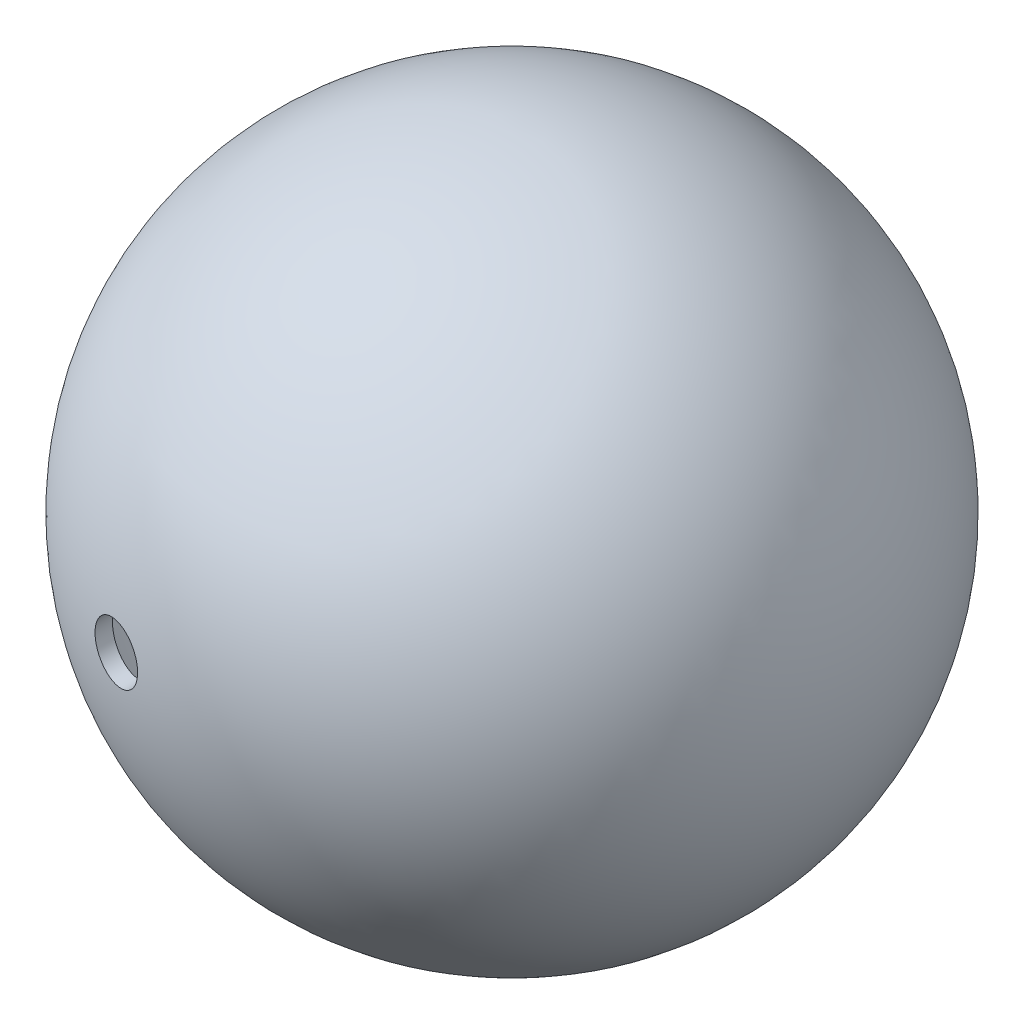
ISO-10303-21;
HEADER;
FILE_DESCRIPTION(('STEP AP214'),'2;1');
FILE_NAME('part.step','',(''),(''),'','','');
FILE_SCHEMA(('AUTOMOTIVE_DESIGN { 1 0 10303 214 1 1 1 1 }'));
ENDSEC;
DATA;
#1=APPLICATION_CONTEXT('core data for automotive mechanical design processes');
#2=APPLICATION_PROTOCOL_DEFINITION('international standard','automotive_design',2000,#1);
#3=PRODUCT_CONTEXT('',#1,'mechanical');
#4=PRODUCT('Part','Part','',(#3));
#5=PRODUCT_RELATED_PRODUCT_CATEGORY('part','',(#4));
#6=PRODUCT_DEFINITION_FORMATION('','',#4);
#7=PRODUCT_DEFINITION_CONTEXT('part definition',#1,'design');
#8=PRODUCT_DEFINITION('design','',#6,#7);
#9=PRODUCT_DEFINITION_SHAPE('','',#8);
#10=(LENGTH_UNIT() NAMED_UNIT(*) SI_UNIT(.MILLI.,.METRE.));
#11=(NAMED_UNIT(*) PLANE_ANGLE_UNIT() SI_UNIT($,.RADIAN.));
#12=(NAMED_UNIT(*) SI_UNIT($,.STERADIAN.) SOLID_ANGLE_UNIT());
#13=UNCERTAINTY_MEASURE_WITH_UNIT(LENGTH_MEASURE(1.E-05),#10,'distance_accuracy_value','');
#14=(GEOMETRIC_REPRESENTATION_CONTEXT(3) GLOBAL_UNCERTAINTY_ASSIGNED_CONTEXT((#13)) GLOBAL_UNIT_ASSIGNED_CONTEXT((#10,
#11,#12)) REPRESENTATION_CONTEXT('',''));
#15=CARTESIAN_POINT('',(0.,0.,0.));
#16=DIRECTION('',(0.,0.,1.));
#17=DIRECTION('',(1.,0.,0.));
#18=AXIS2_PLACEMENT_3D('',#15,#16,#17);
#19=CARTESIAN_POINT('',(0.,0.,0.));
#20=DIRECTION('',(0.,1.,0.));
#21=DIRECTION('',(1.,0.,0.));
#22=AXIS2_PLACEMENT_3D('',#19,#20,#21);
#23=SPHERICAL_SURFACE('',#22,12.98);
#24=CARTESIAN_POINT('',(-3.89947289119737,-0.633204957340862,12.3642048936766));
#25=CARTESIAN_POINT('',(-3.86347402960538,-0.684336265587655,12.3729395038252));
#26=CARTESIAN_POINT('',(-3.82315602540882,-0.732316081182053,12.3827128415907));
#27=CARTESIAN_POINT('',(-3.73517450469108,-0.820618555667838,12.4040100900181));
#28=CARTESIAN_POINT('',(-3.68749971764789,-0.860929250324411,12.4155366862613));
#29=CARTESIAN_POINT('',(-3.58635865770695,-0.93274988924588,12.4399516311496));
#30=CARTESIAN_POINT('',(-3.53290194195186,-0.964274057569683,12.4528377317831));
#31=CARTESIAN_POINT('',(-3.42168752687481,-1.01783566328814,12.4796015065705));
#32=CARTESIAN_POINT('',(-3.36393095319897,-1.03987557336427,12.4934789211732));
#33=CARTESIAN_POINT('',(-3.24453851880642,-1.07430660843086,12.522115543174));
#34=CARTESIAN_POINT('',(-3.1828491778697,-1.08650251265162,12.5368866259211));
#35=CARTESIAN_POINT('',(-3.0583406970183,-1.10023648515423,12.5666454265199));
#36=CARTESIAN_POINT('',(-2.99552139128842,-1.10177297622939,12.5816331761017));
#37=CARTESIAN_POINT('',(-2.86961017544639,-1.09408932709861,12.6116203105305));
#38=CARTESIAN_POINT('',(-2.8065267217662,-1.08471858161784,12.6266169315695));
#39=CARTESIAN_POINT('',(-2.68278191440778,-1.0551866337861,12.655983733104));
#40=CARTESIAN_POINT('',(-2.62212058071725,-1.03502534240968,12.67035390843));
#41=CARTESIAN_POINT('',(-2.50521624637742,-0.984494165872218,12.6980035093477));
#42=CARTESIAN_POINT('',(-2.44895769149386,-0.9541624247022,12.7112867831258));
#43=CARTESIAN_POINT('',(-2.34231961507966,-0.884040352638639,12.7364296630988));
#44=CARTESIAN_POINT('',(-2.291939532107,-0.844250926135402,12.7482894052558));
#45=CARTESIAN_POINT('',(-2.1995754853051,-0.757146781453644,12.7700063808177));
#46=CARTESIAN_POINT('',(-2.15744652779762,-0.709994538671565,12.7798982555748));
#47=CARTESIAN_POINT('',(-2.08174291335744,-0.608924024543547,12.7976568800191));
#48=CARTESIAN_POINT('',(-2.04816694546041,-0.555006791998425,12.805523940063));
#49=CARTESIAN_POINT('',(-1.99146543210071,-0.443472834045484,12.8188006654771));
#50=CARTESIAN_POINT('',(-1.96808667401949,-0.385991899056834,12.8242698930764));
#51=CARTESIAN_POINT('',(-1.93129238192234,-0.267760079747284,12.8328743622384));
#52=CARTESIAN_POINT('',(-1.91787545459748,-0.207009653988097,12.8360099301979));
#53=CARTESIAN_POINT('',(-1.90163937122023,-0.0853705007425076,12.8398040216704));
#54=CARTESIAN_POINT('',(-1.89859814457086,-0.0245129441589638,12.8405144505054));
#55=CARTESIAN_POINT('',(-1.90259141759655,0.0968500615558506,12.8395814461705));
#56=CARTESIAN_POINT('',(-1.90962526930268,0.157355533079852,12.8379381643771));
#57=CARTESIAN_POINT('',(-1.93344398306831,0.275830278778367,12.8323709294729));
#58=CARTESIAN_POINT('',(-1.95015556342003,0.333815130227916,12.8284641161726));
#59=CARTESIAN_POINT('',(-1.99273429844873,0.446119405242145,12.8185029884239));
#60=CARTESIAN_POINT('',(-2.01860169147492,0.500438733340044,12.8124486180691));
#61=CARTESIAN_POINT('',(-2.07896686209375,0.604439043780939,12.798306492972));
#62=CARTESIAN_POINT('',(-2.1135426370796,0.6540722107765,12.7902003579762));
#63=CARTESIAN_POINT('',(-2.19014950721767,0.746834516630825,12.7722192120379));
#64=CARTESIAN_POINT('',(-2.23218133245367,0.789963017797907,12.7623440278721));
#65=CARTESIAN_POINT('',(-2.32347875816805,0.869520019063363,12.7408651614933));
#66=CARTESIAN_POINT('',(-2.37288326464253,0.905780075092502,12.7292282063553));
#67=CARTESIAN_POINT('',(-2.47678612116844,0.969517095603996,12.7047169727589));
#68=CARTESIAN_POINT('',(-2.53128514307572,0.996992899516551,12.6918425310965));
#69=CARTESIAN_POINT('',(-2.64534071413173,1.04311922192829,12.6648546083289));
#70=CARTESIAN_POINT('',(-2.70499175458851,1.06152245982691,12.6507176570829));
#71=CARTESIAN_POINT('',(-2.82641644332501,1.08799416567113,12.621890075965));
#72=CARTESIAN_POINT('',(-2.88819034414862,1.09606139960393,12.6071993801971));
#73=CARTESIAN_POINT('',(-3.01337667711194,1.10173576012323,12.5773751808483));
#74=CARTESIAN_POINT('',(-3.0767977384234,1.09913822845364,12.5622386006044));
#75=CARTESIAN_POINT('',(-3.20231737152421,1.08308420645977,12.5322272969657));
#76=CARTESIAN_POINT('',(-3.26441587344272,1.06962714387956,12.5173525874129));
#77=CARTESIAN_POINT('',(-3.38577035196042,1.03210022530322,12.4882340943519));
#78=CARTESIAN_POINT('',(-3.4450138567443,1.00798779347408,12.4739930968292));
#79=CARTESIAN_POINT('',(-3.55863735431063,0.949736458463024,12.4466366197832));
#80=CARTESIAN_POINT('',(-3.61301758480918,0.915598045699332,12.4335210852487));
#81=CARTESIAN_POINT('',(-3.71452390709142,0.838720734114874,12.4090049964268));
#82=CARTESIAN_POINT('',(-3.76174042584868,0.79610814634968,12.3975831141567));
#83=CARTESIAN_POINT('',(-3.84831237736135,0.703134986490585,12.3766164968889));
#84=CARTESIAN_POINT('',(-3.88766894630155,0.652775536100112,12.3670714905848));
#85=CARTESIAN_POINT('',(-3.95629095567472,0.547147231418268,12.3504138428761));
#86=CARTESIAN_POINT('',(-3.9857940041799,0.492041794601926,12.3432439686869));
#87=CARTESIAN_POINT('',(-4.03510693024533,0.377417470714795,12.3312527597219));
#88=CARTESIAN_POINT('',(-4.0549188304659,0.317899507580594,12.3264309348806));
#89=CARTESIAN_POINT('',(-4.08377698031408,0.197835804615348,12.3194054330408));
#90=CARTESIAN_POINT('',(-4.0930943245287,0.137358975916602,12.3171358298861));
#91=CARTESIAN_POINT('',(-4.10157904938693,0.0156403098949137,12.3150690960885));
#92=CARTESIAN_POINT('',(-4.10074478919225,-0.0456016495005932,12.3152723651442));
#93=CARTESIAN_POINT('',(-4.08903436336953,-0.16621870889189,12.3181246838287));
#94=CARTESIAN_POINT('',(-4.07829296621082,-0.225607829476065,12.3207409095826));
#95=CARTESIAN_POINT('',(-4.04731837823105,-0.341645577950844,12.3282806512792));
#96=CARTESIAN_POINT('',(-4.02709714844567,-0.398297560308858,12.3332012596937));
#97=CARTESIAN_POINT('',(-3.98817587897262,-0.484479860929397,12.3426640802939));
#98=CARTESIAN_POINT('',(-3.97238231787804,-0.515436456751616,12.3465024794598));
#99=CARTESIAN_POINT('',(-3.93799094065438,-0.575651996621588,12.3548562059085));
#100=CARTESIAN_POINT('',(-3.91939319034965,-0.604910980496049,12.3593715173018));
#101=CARTESIAN_POINT('',(-3.89947289119737,-0.633204957340862,12.3642048936766));
#102=B_SPLINE_CURVE_WITH_KNOTS('',3,(#24,#25,#26,#27,#28,#29,#30,#31,#32,#33,#34,#35,#36,#37,
#38,#39,#40,#41,#42,#43,#44,#45,#46,#47,#48,#49,#50,#51,#52,#53,#54,#55,#56,#57,#58,#59,#60,#61,
#62,#63,#64,#65,#66,#67,#68,#69,#70,#71,#72,#73,#74,#75,#76,#77,#78,#79,#80,#81,#82,#83,#84,#85,
#86,#87,#88,#89,#90,#91,#92,#93,#94,#95,#96,#97,#98,#99,#100,#101),.UNSPECIFIED.,.T.,.F.,(4,2,2,
2,2,2,2,2,2,2,2,2,2,2,2,2,2,2,2,2,2,2,2,2,2,2,2,2,2,2,2,2,2,2,2,2,2,2,4),(0.,0.189287328669088,
0.378867576686953,0.56813911642103,0.7573612804231,0.950249659580072,1.14316657861541,
1.33877917710285,1.53439338948175,1.7292820127676,1.92415200733851,2.11520911082475,
2.30623691228077,2.49220566802539,2.67814840839458,2.86008557697745,3.04201104497268,
3.22257662222587,3.40314690040852,3.58539586370391,3.76766268236839,3.95394297146272,
4.14024786162947,4.33138304113057,4.52254103808498,4.71738435973995,4.91223794956646,
5.10787725996042,5.30350700230231,5.49641404129513,5.68929317464696,5.87711319409825,
6.06489399648732,6.24770406247737,6.4305436770718,6.61093220281542,6.79109373611338,
6.89584006822657,7.00058394195125),.UNSPECIFIED.);
#103=CARTESIAN_POINT('',(-3.89947289119737,-0.633204957340862,12.3642048936766));
#104=VERTEX_POINT('',#103);
#105=EDGE_CURVE('E10',#104,#104,#102,.T.);
#106=ORIENTED_EDGE('',*,*,#105,.F.);
#107=EDGE_LOOP('',(#106));
#108=FACE_BOUND('',#107,.T.);
#109=CARTESIAN_POINT('',(0.,0.,-12.4774087591241));
#110=DIRECTION('',(0.,0.,-1.));
#111=DIRECTION('',(-1.,0.,0.));
#112=AXIS2_PLACEMENT_3D('',#109,#110,#111);
#113=CIRCLE('',#112,3.57696388823448);
#114=CARTESIAN_POINT('',(-3.57696388823448,0.,-12.4774087591241));
#115=VERTEX_POINT('',#114);
#116=EDGE_CURVE('E71',#115,#115,#113,.T.);
#117=ORIENTED_EDGE('',*,*,#116,.F.);
#118=EDGE_LOOP('',(#117));
#119=FACE_BOUND('',#118,.T.);
#120=ADVANCED_FACE('F32',(#108,#119),#23,.T.);
#121=CARTESIAN_POINT('',(0.,0.,0.));
#122=DIRECTION('',(0.,1.,0.));
#123=DIRECTION('',(1.,0.,0.));
#124=AXIS2_PLACEMENT_3D('',#121,#122,#123);
#125=SPHERICAL_SURFACE('',#124,12.33);
#126=CARTESIAN_POINT('',(-3.89423857841952,-0.640575807275164,11.6813299127061));
#127=CARTESIAN_POINT('',(-3.85775168175633,-0.691505855556212,11.6907004718159));
#128=CARTESIAN_POINT('',(-3.81696509159421,-0.739223212932149,11.7011640014424));
#129=CARTESIAN_POINT('',(-3.72811549347727,-0.826894922693143,11.7239215486656));
#130=CARTESIAN_POINT('',(-3.68004101211075,-0.866836803491528,11.7362184520507));
#131=CARTESIAN_POINT('',(-3.57819710896939,-0.937834038809236,11.7622228270749));
#132=CARTESIAN_POINT('',(-3.52443782093705,-0.968904852812223,11.7759277875105));
#133=CARTESIAN_POINT('',(-3.41271713300457,-1.02150731349265,11.8043550893527));
#134=CARTESIAN_POINT('',(-3.35475685131224,-1.04304148783234,11.8190771599794));
#135=CARTESIAN_POINT('',(-3.23492437803613,-1.07645792659961,11.8494552267948));
#136=CARTESIAN_POINT('',(-3.17299487658737,-1.08812275102135,11.8651244962458));
#137=CARTESIAN_POINT('',(-3.04809735110112,-1.1007395624117,11.8966619112228));
#138=CARTESIAN_POINT('',(-2.98512916395858,-1.1016898505239,11.9125300878875));
#139=CARTESIAN_POINT('',(-2.85894917270471,-1.09277803432639,11.9442647516258));
#140=CARTESIAN_POINT('',(-2.79574781632589,-1.08275396486635,11.96012766214));
#141=CARTESIAN_POINT('',(-2.67187161406038,-1.05185862975064,11.9911597111651));
#142=CARTESIAN_POINT('',(-2.61119678222989,-1.03098730375545,12.0063288458163));
#143=CARTESIAN_POINT('',(-2.4944472361188,-0.979019530976722,12.0354654254668));
#144=CARTESIAN_POINT('',(-2.43835175318607,-0.947972868987433,12.0494383116953));
#145=CARTESIAN_POINT('',(-2.33215852169005,-0.876405111618228,12.0758487686261));
#146=CARTESIAN_POINT('',(-2.28206011160448,-0.835885062683024,12.0882865086713));
#147=CARTESIAN_POINT('',(-2.19051068611181,-0.74745383396816,12.110985184453));
#148=CARTESIAN_POINT('',(-2.14889219024592,-0.699726991745772,12.1212883657112));
#149=CARTESIAN_POINT('',(-2.0743040534998,-0.597565732522574,12.1397348007515));
#150=CARTESIAN_POINT('',(-2.04133291737108,-0.543132477549204,12.1478784279533));
#151=CARTESIAN_POINT('',(-1.98600320550661,-0.430828854076708,12.1615346985292));
#152=CARTESIAN_POINT('',(-1.96336075390828,-0.373106866502893,12.167117744494));
#153=CARTESIAN_POINT('',(-1.92806232592623,-0.254510351422112,12.175818049115));
#154=CARTESIAN_POINT('',(-1.91540481518788,-0.19363630981407,12.1789356866231));
#155=CARTESIAN_POINT('',(-1.90069042842959,-0.0719989410932524,12.1825596919018));
#156=CARTESIAN_POINT('',(-1.89839183652547,-0.0112665175828894,12.183125602065));
#157=CARTESIAN_POINT('',(-1.90381222079359,0.109719523717276,12.1817908008469));
#158=CARTESIAN_POINT('',(-1.91153052207379,0.169973173489462,12.1798902556438));
#159=CARTESIAN_POINT('',(-1.93662729615165,0.287820915290548,12.1737071415375));
#160=CARTESIAN_POINT('',(-1.95393183956863,0.3454317515228,12.1694428021302));
#161=CARTESIAN_POINT('',(-1.99758604642471,0.456890520775181,12.1586764300414));
#162=CARTESIAN_POINT('',(-2.02393599979012,0.510738333115102,12.1521743256345));
#163=CARTESIAN_POINT('',(-2.08518808249646,0.613800988661716,12.1370436736015));
#164=CARTESIAN_POINT('',(-2.12018018738811,0.66295901673982,12.1283927482544));
#165=CARTESIAN_POINT('',(-2.19749531071848,0.754709587199057,12.1092534664174));
#166=CARTESIAN_POINT('',(-2.23981913093077,0.79730141055672,12.0987649089684));
#167=CARTESIAN_POINT('',(-2.33169350436811,0.875847118205251,12.0759625649929));
#168=CARTESIAN_POINT('',(-2.3813966112871,0.911611273715355,12.0636101261537));
#169=CARTESIAN_POINT('',(-2.48578246000546,0.974314690876098,12.0376232685963));
#170=CARTESIAN_POINT('',(-2.54046592479811,1.00125266862192,12.0239886637381));
#171=CARTESIAN_POINT('',(-2.65493706198322,1.04633777753928,11.995394432145));
#172=CARTESIAN_POINT('',(-2.714826166912,1.064210506997,11.9804080123852));
#173=CARTESIAN_POINT('',(-2.83662519023071,1.08957781020603,11.9498695396523));
#174=CARTESIAN_POINT('',(-2.89853537209928,1.09707102525228,11.9343174129001));
#175=CARTESIAN_POINT('',(-3.0240109672061,1.1015655112816,11.9027345027742));
#176=CARTESIAN_POINT('',(-3.08758373787051,1.09834201062414,11.8867005446218));
#177=CARTESIAN_POINT('',(-3.21330230247774,1.08098531466911,11.8549288754347));
#178=CARTESIAN_POINT('',(-3.27544801462931,1.06685149565048,11.8391911813895));
#179=CARTESIAN_POINT('',(-3.39678914828294,1.02792707492006,11.8084039193739));
#180=CARTESIAN_POINT('',(-3.45597158942173,1.00309350739992,11.793357399366));
#181=CARTESIAN_POINT('',(-3.56935360770841,0.94336693150768,11.764479887607));
#182=CARTESIAN_POINT('',(-3.62355347135851,0.908474502006026,11.7506488259681));
#183=CARTESIAN_POINT('',(-3.7244656393364,0.830158733273977,11.7248569343794));
#184=CARTESIAN_POINT('',(-3.77128351850179,0.786880233027356,11.7128698085625));
#185=CARTESIAN_POINT('',(-3.85694498529733,0.69260344044194,11.6909089026003));
#186=CARTESIAN_POINT('',(-3.8957898926853,0.641606428172513,11.6809347892478));
#187=CARTESIAN_POINT('',(-3.96316869169015,0.534946377306921,11.6636169741754));
#188=CARTESIAN_POINT('',(-3.9919729189442,0.479465333574898,11.6562043640814));
#189=CARTESIAN_POINT('',(-4.03983487679804,0.364191635903038,11.6438794654926));
#190=CARTESIAN_POINT('',(-4.05889484495732,0.30439997540504,11.6389666029858));
#191=CARTESIAN_POINT('',(-4.08618773235738,0.184091617850248,11.6319295782436));
#192=CARTESIAN_POINT('',(-4.09472192469567,0.123647670689082,11.6297278208508));
#193=CARTESIAN_POINT('',(-4.10167983764615,0.00212712013117659,11.6279328279403));
#194=CARTESIAN_POINT('',(-4.10010198990579,-0.0589495799372979,11.6283399970607));
#195=CARTESIAN_POINT('',(-4.08698674491201,-0.179049488812694,11.631723098003));
#196=CARTESIAN_POINT('',(-4.07559287419262,-0.238089596578929,11.6346620114797));
#197=CARTESIAN_POINT('',(-4.0434245312293,-0.353319949508063,11.6429536562815));
#198=CARTESIAN_POINT('',(-4.02266188735208,-0.409513689101712,11.6483033439182));
#199=CARTESIAN_POINT('',(-3.98311736873325,-0.494632619196736,11.6584822938749));
#200=CARTESIAN_POINT('',(-3.96722259597301,-0.525024790432751,11.6625719301515));
#201=CARTESIAN_POINT('',(-3.93272353188613,-0.584121147319811,11.6714428652333));
#202=CARTESIAN_POINT('',(-3.91411931667609,-0.612825380358452,11.6762241446081));
#203=CARTESIAN_POINT('',(-3.89423857841952,-0.640575807275164,11.6813299127061));
#204=B_SPLINE_CURVE_WITH_KNOTS('',3,(#126,#127,#128,#129,#130,#131,#132,#133,#134,#135,#136,
#137,#138,#139,#140,#141,#142,#143,#144,#145,#146,#147,#148,#149,#150,#151,#152,#153,#154,#155,
#156,#157,#158,#159,#160,#161,#162,#163,#164,#165,#166,#167,#168,#169,#170,#171,#172,#173,#174,
#175,#176,#177,#178,#179,#180,#181,#182,#183,#184,#185,#186,#187,#188,#189,#190,#191,#192,#193,
#194,#195,#196,#197,#198,#199,#200,#201,#202,#203),.UNSPECIFIED.,.T.,.F.,(4,2,2,2,2,2,2,2,2,2,2,
2,2,2,2,2,2,2,2,2,2,2,2,2,2,2,2,2,2,2,2,2,2,2,2,2,2,2,4),(0.,0.189913425448115,
0.380128999789478,0.57001103608797,0.759842714467535,0.953755231429849,1.14769849399646,
1.34454313137859,1.54138886375081,1.73728551987691,1.93316054717614,2.1246810849295,
2.31616848425834,2.5020180834332,2.68783911811498,2.86930095235598,3.05075056117062,
3.23081992316923,3.41089505734623,3.59293047056877,3.77498580319878,3.96153346287635,
4.14810824677695,4.34003620855183,4.5319892918157,4.72799357199572,4.92400905817813,
5.12081910746094,5.31761783291959,5.51127977672094,5.70490963796116,5.89282825245518,
6.08070369607811,6.26306658427347,6.44545775718859,6.62522647431475,6.80476886015796,
6.90825053438461,7.01172930205272),.UNSPECIFIED.);
#205=CARTESIAN_POINT('',(-3.89423857841952,-0.640575807275164,11.6813299127061));
#206=VERTEX_POINT('',#205);
#207=EDGE_CURVE('E36',#206,#206,#204,.T.);
#208=ORIENTED_EDGE('',*,*,#207,.T.);
#209=EDGE_LOOP('',(#208));
#210=FACE_BOUND('',#209,.T.);
#211=CARTESIAN_POINT('',(0.,0.,-11.9650364963504));
#212=DIRECTION('',(0.,0.,-1.));
#213=DIRECTION('',(-1.,0.,0.));
#214=AXIS2_PLACEMENT_3D('',#211,#212,#213);
#215=CIRCLE('',#214,2.97771752202988);
#216=CARTESIAN_POINT('',(-2.97771752202988,0.,-11.9650364963504));
#217=VERTEX_POINT('',#216);
#218=EDGE_CURVE('E46',#217,#217,#215,.T.);
#219=ORIENTED_EDGE('',*,*,#218,.T.);
#220=EDGE_LOOP('',(#219));
#221=FACE_BOUND('',#220,.T.);
#222=ADVANCED_FACE('F56',(#210,#221),#125,.F.);
#223=CARTESIAN_POINT('',(-3.,0.,50.));
#224=DIRECTION('',(0.,0.,-1.));
#225=DIRECTION('',(-1.,0.,0.));
#226=AXIS2_PLACEMENT_3D('',#223,#224,#225);
#227=CYLINDRICAL_SURFACE('',#226,1.1);
#228=ORIENTED_EDGE('',*,*,#207,.F.);
#229=EDGE_LOOP('',(#228));
#230=FACE_BOUND('',#229,.T.);
#231=ORIENTED_EDGE('',*,*,#105,.T.);
#232=EDGE_LOOP('',(#231));
#233=FACE_BOUND('',#232,.T.);
#234=ADVANCED_FACE('F51',(#230,#233),#227,.F.);
#235=CARTESIAN_POINT('',(0.,0.,-11.9650364963504));
#236=DIRECTION('',(0.,0.,-1.));
#237=DIRECTION('',(-1.,0.,0.));
#238=AXIS2_PLACEMENT_3D('',#235,#236,#237);
#239=CONICAL_SURFACE('',#238,2.97771752202988,0.863390635833672);
#240=ORIENTED_EDGE('',*,*,#116,.T.);
#241=EDGE_LOOP('',(#240));
#242=FACE_BOUND('',#241,.T.);
#243=ORIENTED_EDGE('',*,*,#218,.F.);
#244=EDGE_LOOP('',(#243));
#245=FACE_BOUND('',#244,.T.);
#246=ADVANCED_FACE('F55',(#242,#245),#239,.F.);
#247=CLOSED_SHELL('',(#120,#222,#234,#246));
#248=MANIFOLD_SOLID_BREP('B2',#247);
#249=ADVANCED_BREP_SHAPE_REPRESENTATION('',(#18,#248),#14);
#250=SHAPE_DEFINITION_REPRESENTATION(#9,#249);
ENDSEC;
END-ISO-10303-21;
